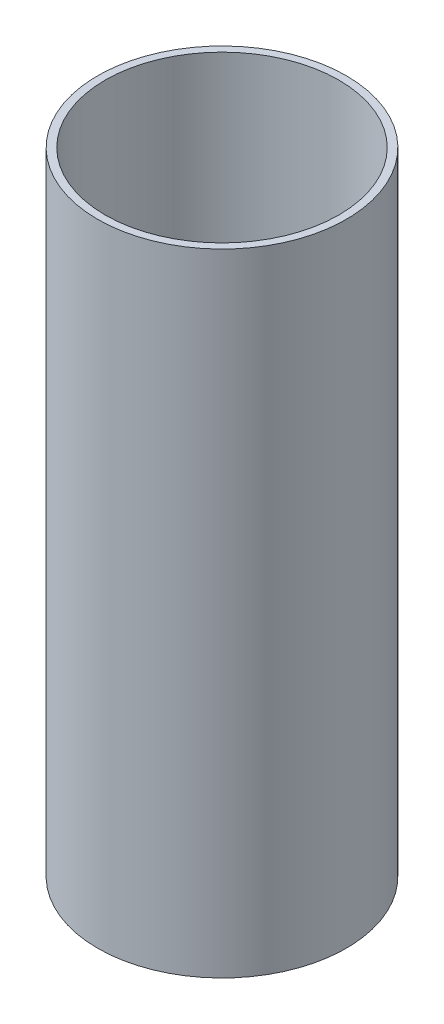
ISO-10303-21;
HEADER;
FILE_DESCRIPTION(('STEP AP214'),'2;1');
FILE_NAME('part.step','',(''),(''),'','','');
FILE_SCHEMA(('AUTOMOTIVE_DESIGN { 1 0 10303 214 1 1 1 1 }'));
ENDSEC;
DATA;
#1=APPLICATION_CONTEXT('core data for automotive mechanical design processes');
#2=APPLICATION_PROTOCOL_DEFINITION('international standard','automotive_design',2000,#1);
#3=PRODUCT_CONTEXT('',#1,'mechanical');
#4=PRODUCT('Part','Part','',(#3));
#5=PRODUCT_RELATED_PRODUCT_CATEGORY('part','',(#4));
#6=PRODUCT_DEFINITION_FORMATION('','',#4);
#7=PRODUCT_DEFINITION_CONTEXT('part definition',#1,'design');
#8=PRODUCT_DEFINITION('design','',#6,#7);
#9=PRODUCT_DEFINITION_SHAPE('','',#8);
#10=(LENGTH_UNIT() NAMED_UNIT(*) SI_UNIT(.MILLI.,.METRE.));
#11=(NAMED_UNIT(*) PLANE_ANGLE_UNIT() SI_UNIT($,.RADIAN.));
#12=(NAMED_UNIT(*) SI_UNIT($,.STERADIAN.) SOLID_ANGLE_UNIT());
#13=UNCERTAINTY_MEASURE_WITH_UNIT(LENGTH_MEASURE(1.E-05),#10,'distance_accuracy_value','');
#14=(GEOMETRIC_REPRESENTATION_CONTEXT(3) GLOBAL_UNCERTAINTY_ASSIGNED_CONTEXT((#13)) GLOBAL_UNIT_ASSIGNED_CONTEXT((#10,
#11,#12)) REPRESENTATION_CONTEXT('',''));
#15=CARTESIAN_POINT('',(0.,0.,0.));
#16=DIRECTION('',(0.,0.,1.));
#17=DIRECTION('',(1.,0.,0.));
#18=AXIS2_PLACEMENT_3D('',#15,#16,#17);
#19=CARTESIAN_POINT('',(0.,168.,0.));
#20=DIRECTION('',(0.,-1.,0.));
#21=DIRECTION('',(0.,0.,-1.));
#22=AXIS2_PLACEMENT_3D('',#19,#20,#21);
#23=CYLINDRICAL_SURFACE('',#22,31.1);
#24=CARTESIAN_POINT('',(0.,168.,0.));
#25=DIRECTION('',(0.,1.,0.));
#26=DIRECTION('',(0.,0.,1.));
#27=AXIS2_PLACEMENT_3D('',#24,#25,#26);
#28=CIRCLE('',#27,31.1);
#29=CARTESIAN_POINT('',(0.,168.,-31.1));
#30=VERTEX_POINT('',#29);
#31=EDGE_CURVE('E57',#30,#30,#28,.T.);
#32=CARTESIAN_POINT('',(0.,2.,0.));
#33=DIRECTION('',(0.,1.,0.));
#34=DIRECTION('',(0.,0.,1.));
#35=AXIS2_PLACEMENT_3D('',#32,#33,#34);
#36=CIRCLE('',#35,31.1);
#37=CARTESIAN_POINT('',(0.,2.,-31.1));
#38=VERTEX_POINT('',#37);
#39=EDGE_CURVE('E10',#38,#38,#36,.T.);
#40=CARTESIAN_POINT('',(0.,168.,-31.1));
#41=CARTESIAN_POINT('',(0.,166.270833333333,-31.1));
#42=CARTESIAN_POINT('',(0.,164.541666666667,-31.1));
#43=CARTESIAN_POINT('',(0.,161.083333333333,-31.1));
#44=CARTESIAN_POINT('',(0.,159.354166666667,-31.1));
#45=CARTESIAN_POINT('',(0.,155.895833333333,-31.1));
#46=CARTESIAN_POINT('',(0.,154.166666666667,-31.1));
#47=CARTESIAN_POINT('',(0.,150.708333333333,-31.1));
#48=CARTESIAN_POINT('',(0.,148.979166666667,-31.1));
#49=CARTESIAN_POINT('',(0.,145.520833333333,-31.1));
#50=CARTESIAN_POINT('',(0.,143.791666666667,-31.1));
#51=CARTESIAN_POINT('',(0.,140.333333333333,-31.1));
#52=CARTESIAN_POINT('',(0.,138.604166666667,-31.1));
#53=CARTESIAN_POINT('',(0.,135.145833333333,-31.1));
#54=CARTESIAN_POINT('',(0.,133.416666666667,-31.1));
#55=CARTESIAN_POINT('',(0.,129.958333333333,-31.1));
#56=CARTESIAN_POINT('',(0.,128.229166666667,-31.1));
#57=CARTESIAN_POINT('',(0.,124.770833333333,-31.1));
#58=CARTESIAN_POINT('',(0.,123.041666666667,-31.1));
#59=CARTESIAN_POINT('',(0.,119.583333333333,-31.1));
#60=CARTESIAN_POINT('',(0.,117.854166666667,-31.1));
#61=CARTESIAN_POINT('',(0.,114.395833333333,-31.1));
#62=CARTESIAN_POINT('',(0.,112.666666666667,-31.1));
#63=CARTESIAN_POINT('',(0.,109.208333333333,-31.1));
#64=CARTESIAN_POINT('',(0.,107.479166666667,-31.1));
#65=CARTESIAN_POINT('',(0.,104.020833333333,-31.1));
#66=CARTESIAN_POINT('',(0.,102.291666666667,-31.1));
#67=CARTESIAN_POINT('',(0.,98.8333333333333,-31.1));
#68=CARTESIAN_POINT('',(0.,97.1041666666667,-31.1));
#69=CARTESIAN_POINT('',(0.,93.6458333333333,-31.1));
#70=CARTESIAN_POINT('',(0.,91.9166666666667,-31.1));
#71=CARTESIAN_POINT('',(0.,88.4583333333333,-31.1));
#72=CARTESIAN_POINT('',(0.,86.7291666666667,-31.1));
#73=CARTESIAN_POINT('',(0.,83.2708333333333,-31.1));
#74=CARTESIAN_POINT('',(0.,81.5416666666667,-31.1));
#75=CARTESIAN_POINT('',(0.,78.0833333333333,-31.1));
#76=CARTESIAN_POINT('',(0.,76.3541666666667,-31.1));
#77=CARTESIAN_POINT('',(0.,72.8958333333333,-31.1));
#78=CARTESIAN_POINT('',(0.,71.1666666666667,-31.1));
#79=CARTESIAN_POINT('',(0.,67.7083333333333,-31.1));
#80=CARTESIAN_POINT('',(0.,65.9791666666667,-31.1));
#81=CARTESIAN_POINT('',(0.,62.5208333333333,-31.1));
#82=CARTESIAN_POINT('',(0.,60.7916666666667,-31.1));
#83=CARTESIAN_POINT('',(0.,57.3333333333333,-31.1));
#84=CARTESIAN_POINT('',(0.,55.6041666666667,-31.1));
#85=CARTESIAN_POINT('',(0.,52.1458333333333,-31.1));
#86=CARTESIAN_POINT('',(0.,50.4166666666667,-31.1));
#87=CARTESIAN_POINT('',(0.,46.9583333333333,-31.1));
#88=CARTESIAN_POINT('',(0.,45.2291666666667,-31.1));
#89=CARTESIAN_POINT('',(0.,41.7708333333333,-31.1));
#90=CARTESIAN_POINT('',(0.,40.0416666666667,-31.1));
#91=CARTESIAN_POINT('',(0.,36.5833333333333,-31.1));
#92=CARTESIAN_POINT('',(0.,34.8541666666667,-31.1));
#93=CARTESIAN_POINT('',(0.,31.3958333333333,-31.1));
#94=CARTESIAN_POINT('',(0.,29.6666666666667,-31.1));
#95=CARTESIAN_POINT('',(0.,26.2083333333333,-31.1));
#96=CARTESIAN_POINT('',(0.,24.4791666666667,-31.1));
#97=CARTESIAN_POINT('',(0.,21.0208333333333,-31.1));
#98=CARTESIAN_POINT('',(0.,19.2916666666667,-31.1));
#99=CARTESIAN_POINT('',(0.,15.8333333333333,-31.1));
#100=CARTESIAN_POINT('',(0.,14.1041666666667,-31.1));
#101=CARTESIAN_POINT('',(0.,10.6458333333333,-31.1));
#102=CARTESIAN_POINT('',(0.,8.91666666666667,-31.1));
#103=CARTESIAN_POINT('',(0.,5.45833333333334,-31.1));
#104=CARTESIAN_POINT('',(0.,3.72916666666667,-31.1));
#105=CARTESIAN_POINT('',(0.,2.,-31.1));
#106=B_SPLINE_CURVE_WITH_KNOTS('',3,(#40,#41,#42,#43,#44,#45,#46,#47,#48,#49,#50,#51,#52,#53,
#54,#55,#56,#57,#58,#59,#60,#61,#62,#63,#64,#65,#66,#67,#68,#69,#70,#71,#72,#73,#74,#75,#76,#77,
#78,#79,#80,#81,#82,#83,#84,#85,#86,#87,#88,#89,#90,#91,#92,#93,#94,#95,#96,#97,#98,#99,#100,
#101,#102,#103,#104,#105),.UNSPECIFIED.,.F.,.F.,(4,2,2,2,2,2,2,2,2,2,2,2,2,2,2,2,2,2,2,2,2,2,2,
2,2,2,2,2,2,2,2,2,4),(0.,5.18749999999998,10.375,15.5625,20.75,25.9375,31.125,36.3125,41.5,
46.6875,51.875,57.0625,62.25,67.4375,72.625,77.8125,83.,88.1875,93.375,98.5625,103.75,108.9375,
114.125,119.3125,124.5,129.6875,134.875,140.0625,145.25,150.4375,155.625,160.8125,166.),.UNSPECIFIED.);
#107=EDGE_CURVE('BSEAM38',#30,#38,#106,.T.);
#108=ORIENTED_EDGE('',*,*,#31,.T.);
#109=ORIENTED_EDGE('',*,*,#39,.F.);
#110=ORIENTED_EDGE('',*,*,#107,.T.);
#111=ORIENTED_EDGE('',*,*,#107,.F.);
#112=EDGE_LOOP('',(#108,#110,#109,#111));
#113=FACE_BOUND('',#112,.T.);
#114=ADVANCED_FACE('F38',(#113),#23,.F.);
#115=CARTESIAN_POINT('',(0.,2.,0.));
#116=DIRECTION('',(0.,1.,0.));
#117=DIRECTION('',(0.,0.,1.));
#118=AXIS2_PLACEMENT_3D('',#115,#116,#117);
#119=PLANE('',#118);
#120=ORIENTED_EDGE('',*,*,#39,.T.);
#121=EDGE_LOOP('',(#120));
#122=FACE_BOUND('',#121,.T.);
#123=ADVANCED_FACE('F40',(#122),#119,.T.);
#124=CARTESIAN_POINT('',(0.,168.,0.));
#125=DIRECTION('',(0.,-1.,0.));
#126=DIRECTION('',(0.,0.,-1.));
#127=AXIS2_PLACEMENT_3D('',#124,#125,#126);
#128=CYLINDRICAL_SURFACE('',#127,33.1);
#129=CARTESIAN_POINT('',(0.,168.,0.));
#130=DIRECTION('',(0.,1.,0.));
#131=DIRECTION('',(0.,0.,1.));
#132=AXIS2_PLACEMENT_3D('',#129,#130,#131);
#133=CIRCLE('',#132,33.1);
#134=CARTESIAN_POINT('',(0.,168.,-33.1));
#135=VERTEX_POINT('',#134);
#136=EDGE_CURVE('E46',#135,#135,#133,.T.);
#137=CARTESIAN_POINT('',(0.,0.,0.));
#138=DIRECTION('',(0.,1.,0.));
#139=DIRECTION('',(0.,0.,1.));
#140=AXIS2_PLACEMENT_3D('',#137,#138,#139);
#141=CIRCLE('',#140,33.1);
#142=CARTESIAN_POINT('',(0.,0.,-33.1));
#143=VERTEX_POINT('',#142);
#144=EDGE_CURVE('E51',#143,#143,#141,.T.);
#145=CARTESIAN_POINT('',(0.,168.,-33.1));
#146=CARTESIAN_POINT('',(0.,166.25,-33.1));
#147=CARTESIAN_POINT('',(0.,164.5,-33.1));
#148=CARTESIAN_POINT('',(0.,161.,-33.1));
#149=CARTESIAN_POINT('',(0.,159.25,-33.1));
#150=CARTESIAN_POINT('',(0.,155.75,-33.1));
#151=CARTESIAN_POINT('',(0.,154.,-33.1));
#152=CARTESIAN_POINT('',(0.,150.5,-33.1));
#153=CARTESIAN_POINT('',(0.,148.75,-33.1));
#154=CARTESIAN_POINT('',(0.,145.25,-33.1));
#155=CARTESIAN_POINT('',(0.,143.5,-33.1));
#156=CARTESIAN_POINT('',(0.,140.,-33.1));
#157=CARTESIAN_POINT('',(0.,138.25,-33.1));
#158=CARTESIAN_POINT('',(0.,134.75,-33.1));
#159=CARTESIAN_POINT('',(0.,133.,-33.1));
#160=CARTESIAN_POINT('',(0.,129.5,-33.1));
#161=CARTESIAN_POINT('',(0.,127.75,-33.1));
#162=CARTESIAN_POINT('',(0.,124.25,-33.1));
#163=CARTESIAN_POINT('',(0.,122.5,-33.1));
#164=CARTESIAN_POINT('',(0.,119.,-33.1));
#165=CARTESIAN_POINT('',(0.,117.25,-33.1));
#166=CARTESIAN_POINT('',(0.,113.75,-33.1));
#167=CARTESIAN_POINT('',(0.,112.,-33.1));
#168=CARTESIAN_POINT('',(0.,108.5,-33.1));
#169=CARTESIAN_POINT('',(0.,106.75,-33.1));
#170=CARTESIAN_POINT('',(0.,103.25,-33.1));
#171=CARTESIAN_POINT('',(0.,101.5,-33.1));
#172=CARTESIAN_POINT('',(0.,98.,-33.1));
#173=CARTESIAN_POINT('',(0.,96.25,-33.1));
#174=CARTESIAN_POINT('',(0.,92.75,-33.1));
#175=CARTESIAN_POINT('',(0.,91.,-33.1));
#176=CARTESIAN_POINT('',(0.,87.5,-33.1));
#177=CARTESIAN_POINT('',(0.,85.75,-33.1));
#178=CARTESIAN_POINT('',(0.,82.25,-33.1));
#179=CARTESIAN_POINT('',(0.,80.5,-33.1));
#180=CARTESIAN_POINT('',(0.,77.,-33.1));
#181=CARTESIAN_POINT('',(0.,75.25,-33.1));
#182=CARTESIAN_POINT('',(0.,71.75,-33.1));
#183=CARTESIAN_POINT('',(0.,70.,-33.1));
#184=CARTESIAN_POINT('',(0.,66.5,-33.1));
#185=CARTESIAN_POINT('',(0.,64.75,-33.1));
#186=CARTESIAN_POINT('',(0.,61.25,-33.1));
#187=CARTESIAN_POINT('',(0.,59.5,-33.1));
#188=CARTESIAN_POINT('',(0.,56.,-33.1));
#189=CARTESIAN_POINT('',(0.,54.25,-33.1));
#190=CARTESIAN_POINT('',(0.,50.75,-33.1));
#191=CARTESIAN_POINT('',(0.,49.,-33.1));
#192=CARTESIAN_POINT('',(0.,45.5,-33.1));
#193=CARTESIAN_POINT('',(0.,43.75,-33.1));
#194=CARTESIAN_POINT('',(0.,40.25,-33.1));
#195=CARTESIAN_POINT('',(0.,38.5,-33.1));
#196=CARTESIAN_POINT('',(0.,35.,-33.1));
#197=CARTESIAN_POINT('',(0.,33.25,-33.1));
#198=CARTESIAN_POINT('',(0.,29.75,-33.1));
#199=CARTESIAN_POINT('',(0.,28.,-33.1));
#200=CARTESIAN_POINT('',(0.,24.5,-33.1));
#201=CARTESIAN_POINT('',(0.,22.75,-33.1));
#202=CARTESIAN_POINT('',(0.,19.25,-33.1));
#203=CARTESIAN_POINT('',(0.,17.5,-33.1));
#204=CARTESIAN_POINT('',(0.,14.,-33.1));
#205=CARTESIAN_POINT('',(0.,12.25,-33.1));
#206=CARTESIAN_POINT('',(0.,8.75000000000001,-33.1));
#207=CARTESIAN_POINT('',(0.,7.00000000000001,-33.1));
#208=CARTESIAN_POINT('',(0.,3.5,-33.1));
#209=CARTESIAN_POINT('',(0.,1.75,-33.1));
#210=CARTESIAN_POINT('',(0.,0.,-33.1));
#211=B_SPLINE_CURVE_WITH_KNOTS('',3,(#145,#146,#147,#148,#149,#150,#151,#152,#153,#154,#155,
#156,#157,#158,#159,#160,#161,#162,#163,#164,#165,#166,#167,#168,#169,#170,#171,#172,#173,#174,
#175,#176,#177,#178,#179,#180,#181,#182,#183,#184,#185,#186,#187,#188,#189,#190,#191,#192,#193,
#194,#195,#196,#197,#198,#199,#200,#201,#202,#203,#204,#205,#206,#207,#208,#209,#210),
.UNSPECIFIED.,.F.,.F.,(4,2,2,2,2,2,2,2,2,2,2,2,2,2,2,2,2,2,2,2,2,2,2,2,2,2,2,2,2,2,2,2,4),(0.,
5.24999999999998,10.5,15.75,21.,26.25,31.5,36.75,42.,47.25,52.5,57.75,63.,68.25,73.5,78.75,84.,
89.25,94.5,99.75,105.,110.25,115.5,120.75,126.,131.25,136.5,141.75,147.,152.25,157.5,162.75,
168.),.UNSPECIFIED.);
#212=EDGE_CURVE('BSEAM68',#135,#143,#211,.T.);
#213=ORIENTED_EDGE('',*,*,#136,.F.);
#214=ORIENTED_EDGE('',*,*,#144,.T.);
#215=ORIENTED_EDGE('',*,*,#212,.T.);
#216=ORIENTED_EDGE('',*,*,#212,.F.);
#217=EDGE_LOOP('',(#213,#215,#214,#216));
#218=FACE_BOUND('',#217,.T.);
#219=ADVANCED_FACE('F68',(#218),#128,.T.);
#220=CARTESIAN_POINT('',(0.,168.,0.));
#221=DIRECTION('',(0.,1.,0.));
#222=DIRECTION('',(0.,0.,1.));
#223=AXIS2_PLACEMENT_3D('',#220,#221,#222);
#224=PLANE('',#223);
#225=ORIENTED_EDGE('',*,*,#31,.F.);
#226=EDGE_LOOP('',(#225));
#227=FACE_BOUND('',#226,.T.);
#228=ORIENTED_EDGE('',*,*,#136,.T.);
#229=EDGE_LOOP('',(#228));
#230=FACE_BOUND('',#229,.T.);
#231=ADVANCED_FACE('F65',(#227,#230),#224,.T.);
#232=CARTESIAN_POINT('',(0.,0.,0.));
#233=DIRECTION('',(0.,1.,0.));
#234=DIRECTION('',(0.,0.,1.));
#235=AXIS2_PLACEMENT_3D('',#232,#233,#234);
#236=PLANE('',#235);
#237=ORIENTED_EDGE('',*,*,#144,.F.);
#238=EDGE_LOOP('',(#237));
#239=FACE_BOUND('',#238,.T.);
#240=ADVANCED_FACE('F67',(#239),#236,.F.);
#241=CLOSED_SHELL('',(#114,#123,#219,#231,#240));
#242=MANIFOLD_SOLID_BREP('B2',#241);
#243=ADVANCED_BREP_SHAPE_REPRESENTATION('',(#18,#242),#14);
#244=SHAPE_DEFINITION_REPRESENTATION(#9,#243);
ENDSEC;
END-ISO-10303-21;
